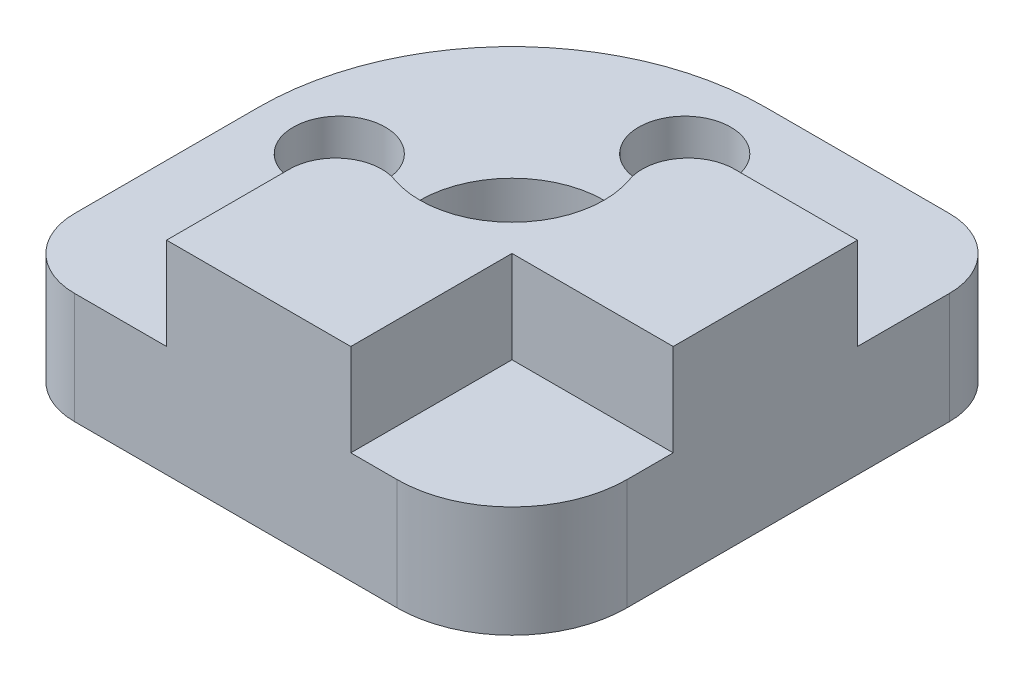
ISO-10303-21;
HEADER;
FILE_DESCRIPTION(('STEP AP214'),'2;1');
FILE_NAME('part.step','',(''),(''),'','','');
FILE_SCHEMA(('AUTOMOTIVE_DESIGN { 1 0 10303 214 1 1 1 1 }'));
ENDSEC;
DATA;
#1=APPLICATION_CONTEXT('core data for automotive mechanical design processes');
#2=APPLICATION_PROTOCOL_DEFINITION('international standard','automotive_design',2000,#1);
#3=PRODUCT_CONTEXT('',#1,'mechanical');
#4=PRODUCT('Part','Part','',(#3));
#5=PRODUCT_RELATED_PRODUCT_CATEGORY('part','',(#4));
#6=PRODUCT_DEFINITION_FORMATION('','',#4);
#7=PRODUCT_DEFINITION_CONTEXT('part definition',#1,'design');
#8=PRODUCT_DEFINITION('design','',#6,#7);
#9=PRODUCT_DEFINITION_SHAPE('','',#8);
#10=(LENGTH_UNIT() NAMED_UNIT(*) SI_UNIT(.MILLI.,.METRE.));
#11=(NAMED_UNIT(*) PLANE_ANGLE_UNIT() SI_UNIT($,.RADIAN.));
#12=(NAMED_UNIT(*) SI_UNIT($,.STERADIAN.) SOLID_ANGLE_UNIT());
#13=UNCERTAINTY_MEASURE_WITH_UNIT(LENGTH_MEASURE(1.E-05),#10,'distance_accuracy_value','');
#14=(GEOMETRIC_REPRESENTATION_CONTEXT(3) GLOBAL_UNCERTAINTY_ASSIGNED_CONTEXT((#13)) GLOBAL_UNIT_ASSIGNED_CONTEXT((#10,
#11,#12)) REPRESENTATION_CONTEXT('',''));
#15=CARTESIAN_POINT('',(0.,0.,0.));
#16=DIRECTION('',(0.,0.,1.));
#17=DIRECTION('',(1.,0.,0.));
#18=AXIS2_PLACEMENT_3D('',#15,#16,#17);
#19=CARTESIAN_POINT('',(0.,4.825,0.));
#20=DIRECTION('',(0.,1.,0.));
#21=DIRECTION('',(0.,0.,1.));
#22=AXIS2_PLACEMENT_3D('',#19,#20,#21);
#23=PLANE('',#22);
#24=DIRECTION('',(0.,0.,1.));
#25=VECTOR('',#24,1.);
#26=CARTESIAN_POINT('',(-4.,4.825,5.65685424949238));
#27=LINE('',#26,#25);
#28=CARTESIAN_POINT('',(-4.,4.825,5.65685424949238));
#29=VERTEX_POINT('',#28);
#30=CARTESIAN_POINT('',(-4.,4.825,11.));
#31=VERTEX_POINT('',#30);
#32=EDGE_CURVE('E49',#29,#31,#27,.T.);
#33=ORIENTED_EDGE('',*,*,#32,.F.);
#34=CARTESIAN_POINT('',(-2.,4.825,5.65685424949238));
#35=DIRECTION('',(0.,1.,0.));
#36=DIRECTION('',(0.,0.,1.));
#37=AXIS2_PLACEMENT_3D('',#34,#35,#36);
#38=CIRCLE('',#37,2.);
#39=CARTESIAN_POINT('',(-1.33333333333333,4.825,3.77123616632825));
#40=VERTEX_POINT('',#39);
#41=EDGE_CURVE('E192',#40,#29,#38,.T.);
#42=ORIENTED_EDGE('',*,*,#41,.F.);
#43=CARTESIAN_POINT('',(0.,4.825,0.));
#44=DIRECTION('',(0.,1.,0.));
#45=DIRECTION('',(0.,0.,1.));
#46=AXIS2_PLACEMENT_3D('',#43,#44,#45);
#47=CIRCLE('',#46,4.);
#48=CARTESIAN_POINT('',(3.77123616632825,4.825,-1.33333333333333));
#49=VERTEX_POINT('',#48);
#50=EDGE_CURVE('E220',#49,#40,#47,.T.);
#51=ORIENTED_EDGE('',*,*,#50,.F.);
#52=CARTESIAN_POINT('',(5.65685424949238,4.825,-2.));
#53=DIRECTION('',(0.,1.,0.));
#54=DIRECTION('',(0.,0.,-1.));
#55=AXIS2_PLACEMENT_3D('',#52,#53,#54);
#56=CIRCLE('',#55,2.);
#57=CARTESIAN_POINT('',(5.65685424949238,4.825,-4.));
#58=VERTEX_POINT('',#57);
#59=EDGE_CURVE('E56',#58,#49,#56,.T.);
#60=ORIENTED_EDGE('',*,*,#59,.F.);
#61=DIRECTION('',(-1.,0.,0.));
#62=VECTOR('',#61,1.);
#63=CARTESIAN_POINT('',(5.65685424949238,4.825,-4.));
#64=LINE('',#63,#62);
#65=CARTESIAN_POINT('',(11.,4.825,-4.));
#66=VERTEX_POINT('',#65);
#67=EDGE_CURVE('E309',#66,#58,#64,.T.);
#68=ORIENTED_EDGE('',*,*,#67,.F.);
#69=DIRECTION('',(0.,0.,-1.));
#70=VECTOR('',#69,1.);
#71=CARTESIAN_POINT('',(11.,4.825,6.));
#72=LINE('',#71,#70);
#73=CARTESIAN_POINT('',(11.,4.825,-7.99999999999998));
#74=VERTEX_POINT('',#73);
#75=EDGE_CURVE('E282',#66,#74,#72,.T.);
#76=ORIENTED_EDGE('',*,*,#75,.T.);
#77=CARTESIAN_POINT('',(8.,4.825,-8.));
#78=DIRECTION('',(0.,1.,0.));
#79=DIRECTION('',(0.,0.,1.));
#80=AXIS2_PLACEMENT_3D('',#77,#78,#79);
#81=CIRCLE('',#80,3.);
#82=CARTESIAN_POINT('',(7.99999999999998,4.825,-11.));
#83=VERTEX_POINT('',#82);
#84=EDGE_CURVE('E277',#74,#83,#81,.T.);
#85=ORIENTED_EDGE('',*,*,#84,.T.);
#86=DIRECTION('',(-1.,0.,0.));
#87=VECTOR('',#86,1.);
#88=CARTESIAN_POINT('',(0.,4.825,-11.));
#89=LINE('',#88,#87);
#90=CARTESIAN_POINT('',(0.,4.825,-11.));
#91=VERTEX_POINT('',#90);
#92=EDGE_CURVE('E259',#83,#91,#89,.T.);
#93=ORIENTED_EDGE('',*,*,#92,.T.);
#94=CARTESIAN_POINT('',(0.,4.825,0.));
#95=DIRECTION('',(0.,1.,0.));
#96=DIRECTION('',(0.,0.,1.));
#97=AXIS2_PLACEMENT_3D('',#94,#95,#96);
#98=CIRCLE('',#97,11.);
#99=CARTESIAN_POINT('',(-11.,4.825,0.));
#100=VERTEX_POINT('',#99);
#101=EDGE_CURVE('E221',#91,#100,#98,.T.);
#102=ORIENTED_EDGE('',*,*,#101,.T.);
#103=DIRECTION('',(0.,0.,1.));
#104=VECTOR('',#103,1.);
#105=CARTESIAN_POINT('',(-11.,4.825,0.));
#106=LINE('',#105,#104);
#107=CARTESIAN_POINT('',(-11.,4.825,7.99999999999998));
#108=VERTEX_POINT('',#107);
#109=EDGE_CURVE('E224',#100,#108,#106,.T.);
#110=ORIENTED_EDGE('',*,*,#109,.T.);
#111=CARTESIAN_POINT('',(-8.,4.825,8.));
#112=DIRECTION('',(0.,1.,0.));
#113=DIRECTION('',(0.,0.,-1.));
#114=AXIS2_PLACEMENT_3D('',#111,#112,#113);
#115=CIRCLE('',#114,3.);
#116=CARTESIAN_POINT('',(-7.99999999999998,4.825,11.));
#117=VERTEX_POINT('',#116);
#118=EDGE_CURVE('E227',#108,#117,#115,.T.);
#119=ORIENTED_EDGE('',*,*,#118,.T.);
#120=DIRECTION('',(1.,0.,0.));
#121=VECTOR('',#120,1.);
#122=CARTESIAN_POINT('',(6.,4.825,11.));
#123=LINE('',#122,#121);
#124=EDGE_CURVE('E237',#117,#31,#123,.T.);
#125=ORIENTED_EDGE('',*,*,#124,.T.);
#126=EDGE_LOOP('',(#33,#42,#51,#60,#68,#76,#85,#93,#102,#110,#119,#125));
#127=FACE_BOUND('',#126,.T.);
#128=CARTESIAN_POINT('',(0.,4.825,-7.5));
#129=DIRECTION('',(0.,1.,0.));
#130=DIRECTION('',(0.,0.,1.));
#131=AXIS2_PLACEMENT_3D('',#128,#129,#130);
#132=CIRCLE('',#131,2.);
#133=CARTESIAN_POINT('',(0.,4.825,-5.5));
#134=VERTEX_POINT('',#133);
#135=EDGE_CURVE('E180',#134,#134,#132,.T.);
#136=ORIENTED_EDGE('',*,*,#135,.F.);
#137=EDGE_LOOP('',(#136));
#138=FACE_BOUND('',#137,.T.);
#139=CARTESIAN_POINT('',(-7.5,4.825,0.));
#140=DIRECTION('',(0.,1.,0.));
#141=DIRECTION('',(0.,0.,1.));
#142=AXIS2_PLACEMENT_3D('',#139,#140,#141);
#143=CIRCLE('',#142,2.);
#144=CARTESIAN_POINT('',(-7.5,4.825,2.));
#145=VERTEX_POINT('',#144);
#146=EDGE_CURVE('E212',#145,#145,#143,.T.);
#147=ORIENTED_EDGE('',*,*,#146,.F.);
#148=EDGE_LOOP('',(#147));
#149=FACE_BOUND('',#148,.T.);
#150=ADVANCED_FACE('F32',(#127,#138,#149),#23,.T.);
#151=DIRECTION('',(1.,0.,0.));
#152=VECTOR('',#151,1.);
#153=CARTESIAN_POINT('',(4.,4.825,4.));
#154=LINE('',#153,#152);
#155=CARTESIAN_POINT('',(4.,4.825,4.));
#156=VERTEX_POINT('',#155);
#157=CARTESIAN_POINT('',(11.,4.825,4.));
#158=VERTEX_POINT('',#157);
#159=EDGE_CURVE('E307',#156,#158,#154,.T.);
#160=ORIENTED_EDGE('',*,*,#159,.F.);
#161=DIRECTION('',(0.,0.,-1.));
#162=VECTOR('',#161,1.);
#163=CARTESIAN_POINT('',(4.,4.825,11.));
#164=LINE('',#163,#162);
#165=CARTESIAN_POINT('',(4.,4.825,11.));
#166=VERTEX_POINT('',#165);
#167=EDGE_CURVE('E310',#166,#156,#164,.T.);
#168=ORIENTED_EDGE('',*,*,#167,.F.);
#169=CARTESIAN_POINT('',(6.,4.825,11.));
#170=VERTEX_POINT('',#169);
#171=EDGE_CURVE('E176',#166,#170,#123,.T.);
#172=ORIENTED_EDGE('',*,*,#171,.T.);
#173=CARTESIAN_POINT('',(6.,4.825,6.));
#174=DIRECTION('',(0.,1.,0.));
#175=DIRECTION('',(0.,0.,-1.));
#176=AXIS2_PLACEMENT_3D('',#173,#174,#175);
#177=CIRCLE('',#176,5.);
#178=CARTESIAN_POINT('',(11.,4.825,6.));
#179=VERTEX_POINT('',#178);
#180=EDGE_CURVE('E231',#170,#179,#177,.T.);
#181=ORIENTED_EDGE('',*,*,#180,.T.);
#182=EDGE_CURVE('E278',#179,#158,#72,.T.);
#183=ORIENTED_EDGE('',*,*,#182,.T.);
#184=EDGE_LOOP('',(#160,#168,#172,#181,#183));
#185=FACE_BOUND('',#184,.T.);
#186=ADVANCED_FACE('F291',(#185),#23,.T.);
#187=CARTESIAN_POINT('',(0.,0.,0.));
#188=DIRECTION('',(0.,1.,0.));
#189=DIRECTION('',(0.,0.,1.));
#190=AXIS2_PLACEMENT_3D('',#187,#188,#189);
#191=PLANE('',#190);
#192=CARTESIAN_POINT('',(-7.5,0.,0.));
#193=DIRECTION('',(0.,1.,0.));
#194=DIRECTION('',(0.,0.,1.));
#195=AXIS2_PLACEMENT_3D('',#192,#193,#194);
#196=CIRCLE('',#195,2.);
#197=CARTESIAN_POINT('',(-7.5,0.,2.));
#198=VERTEX_POINT('',#197);
#199=EDGE_CURVE('E210',#198,#198,#196,.T.);
#200=ORIENTED_EDGE('',*,*,#199,.T.);
#201=EDGE_LOOP('',(#200));
#202=FACE_BOUND('',#201,.T.);
#203=CARTESIAN_POINT('',(0.,0.,0.));
#204=DIRECTION('',(0.,1.,0.));
#205=DIRECTION('',(0.,0.,1.));
#206=AXIS2_PLACEMENT_3D('',#203,#204,#205);
#207=CIRCLE('',#206,11.);
#208=CARTESIAN_POINT('',(0.,0.,-11.));
#209=VERTEX_POINT('',#208);
#210=CARTESIAN_POINT('',(-11.,0.,0.));
#211=VERTEX_POINT('',#210);
#212=EDGE_CURVE('E273',#209,#211,#207,.T.);
#213=ORIENTED_EDGE('',*,*,#212,.F.);
#214=DIRECTION('',(-1.,0.,0.));
#215=VECTOR('',#214,1.);
#216=CARTESIAN_POINT('',(0.,0.,-11.));
#217=LINE('',#216,#215);
#218=CARTESIAN_POINT('',(7.99999999999998,0.,-11.));
#219=VERTEX_POINT('',#218);
#220=EDGE_CURVE('E225',#219,#209,#217,.T.);
#221=ORIENTED_EDGE('',*,*,#220,.F.);
#222=CARTESIAN_POINT('',(8.,0.,-8.));
#223=DIRECTION('',(0.,1.,0.));
#224=DIRECTION('',(0.,0.,1.));
#225=AXIS2_PLACEMENT_3D('',#222,#223,#224);
#226=CIRCLE('',#225,3.);
#227=CARTESIAN_POINT('',(11.,0.,-7.99999999999998));
#228=VERTEX_POINT('',#227);
#229=EDGE_CURVE('E261',#228,#219,#226,.T.);
#230=ORIENTED_EDGE('',*,*,#229,.F.);
#231=DIRECTION('',(0.,0.,-1.));
#232=VECTOR('',#231,1.);
#233=CARTESIAN_POINT('',(11.,0.,6.));
#234=LINE('',#233,#232);
#235=CARTESIAN_POINT('',(11.,0.,6.));
#236=VERTEX_POINT('',#235);
#237=EDGE_CURVE('E263',#236,#228,#234,.T.);
#238=ORIENTED_EDGE('',*,*,#237,.F.);
#239=CARTESIAN_POINT('',(6.,0.,6.));
#240=DIRECTION('',(0.,1.,0.));
#241=DIRECTION('',(0.,0.,-1.));
#242=AXIS2_PLACEMENT_3D('',#239,#240,#241);
#243=CIRCLE('',#242,5.);
#244=CARTESIAN_POINT('',(6.,0.,11.));
#245=VERTEX_POINT('',#244);
#246=EDGE_CURVE('E265',#245,#236,#243,.T.);
#247=ORIENTED_EDGE('',*,*,#246,.F.);
#248=DIRECTION('',(1.,0.,0.));
#249=VECTOR('',#248,1.);
#250=CARTESIAN_POINT('',(6.,0.,11.));
#251=LINE('',#250,#249);
#252=CARTESIAN_POINT('',(-7.99999999999998,0.,11.));
#253=VERTEX_POINT('',#252);
#254=EDGE_CURVE('E267',#253,#245,#251,.T.);
#255=ORIENTED_EDGE('',*,*,#254,.F.);
#256=CARTESIAN_POINT('',(-8.,0.,8.));
#257=DIRECTION('',(0.,1.,0.));
#258=DIRECTION('',(0.,0.,-1.));
#259=AXIS2_PLACEMENT_3D('',#256,#257,#258);
#260=CIRCLE('',#259,3.);
#261=CARTESIAN_POINT('',(-11.,0.,7.99999999999998));
#262=VERTEX_POINT('',#261);
#263=EDGE_CURVE('E269',#262,#253,#260,.T.);
#264=ORIENTED_EDGE('',*,*,#263,.F.);
#265=DIRECTION('',(0.,0.,1.));
#266=VECTOR('',#265,1.);
#267=CARTESIAN_POINT('',(-11.,0.,0.));
#268=LINE('',#267,#266);
#269=EDGE_CURVE('E271',#211,#262,#268,.T.);
#270=ORIENTED_EDGE('',*,*,#269,.F.);
#271=EDGE_LOOP('',(#213,#221,#230,#238,#247,#255,#264,#270));
#272=FACE_BOUND('',#271,.T.);
#273=CARTESIAN_POINT('',(0.,0.,0.));
#274=DIRECTION('',(0.,1.,0.));
#275=DIRECTION('',(0.,0.,1.));
#276=AXIS2_PLACEMENT_3D('',#273,#274,#275);
#277=CIRCLE('',#276,4.);
#278=CARTESIAN_POINT('',(0.,0.,4.));
#279=VERTEX_POINT('',#278);
#280=EDGE_CURVE('E215',#279,#279,#277,.T.);
#281=ORIENTED_EDGE('',*,*,#280,.T.);
#282=EDGE_LOOP('',(#281));
#283=FACE_BOUND('',#282,.T.);
#284=CARTESIAN_POINT('',(0.,0.,-7.5));
#285=DIRECTION('',(0.,1.,0.));
#286=DIRECTION('',(0.,0.,1.));
#287=AXIS2_PLACEMENT_3D('',#284,#285,#286);
#288=CIRCLE('',#287,2.);
#289=CARTESIAN_POINT('',(0.,0.,-5.5));
#290=VERTEX_POINT('',#289);
#291=EDGE_CURVE('E177',#290,#290,#288,.T.);
#292=ORIENTED_EDGE('',*,*,#291,.T.);
#293=EDGE_LOOP('',(#292));
#294=FACE_BOUND('',#293,.T.);
#295=ADVANCED_FACE('F373',(#202,#272,#283,#294),#191,.F.);
#296=CARTESIAN_POINT('',(0.,4.825,0.));
#297=DIRECTION('',(0.,-1.,0.));
#298=DIRECTION('',(0.,0.,-1.));
#299=AXIS2_PLACEMENT_3D('',#296,#297,#298);
#300=CYLINDRICAL_SURFACE('',#299,11.);
#301=ORIENTED_EDGE('',*,*,#212,.T.);
#302=DIRECTION('',(0.,-1.,0.));
#303=VECTOR('',#302,1.);
#304=CARTESIAN_POINT('',(-11.,4.825,0.));
#305=LINE('',#304,#303);
#306=EDGE_CURVE('E11',#100,#211,#305,.T.);
#307=ORIENTED_EDGE('',*,*,#306,.F.);
#308=ORIENTED_EDGE('',*,*,#101,.F.);
#309=DIRECTION('',(0.,-1.,0.));
#310=VECTOR('',#309,1.);
#311=CARTESIAN_POINT('',(0.,4.825,-11.));
#312=LINE('',#311,#310);
#313=EDGE_CURVE('E256',#91,#209,#312,.T.);
#314=ORIENTED_EDGE('',*,*,#313,.T.);
#315=EDGE_LOOP('',(#301,#307,#308,#314));
#316=FACE_BOUND('',#315,.T.);
#317=ADVANCED_FACE('F34',(#316),#300,.T.);
#318=CARTESIAN_POINT('',(-11.,4.825,0.));
#319=DIRECTION('',(1.,0.,0.));
#320=DIRECTION('',(0.,0.,-1.));
#321=AXIS2_PLACEMENT_3D('',#318,#319,#320);
#322=PLANE('',#321);
#323=ORIENTED_EDGE('',*,*,#269,.T.);
#324=DIRECTION('',(0.,-1.,0.));
#325=VECTOR('',#324,1.);
#326=CARTESIAN_POINT('',(-11.,4.825,7.99999999999998));
#327=LINE('',#326,#325);
#328=EDGE_CURVE('E41',#108,#262,#327,.T.);
#329=ORIENTED_EDGE('',*,*,#328,.F.);
#330=ORIENTED_EDGE('',*,*,#109,.F.);
#331=ORIENTED_EDGE('',*,*,#306,.T.);
#332=EDGE_LOOP('',(#323,#329,#330,#331));
#333=FACE_BOUND('',#332,.T.);
#334=ADVANCED_FACE('F389',(#333),#322,.F.);
#335=CARTESIAN_POINT('',(-8.,4.825,8.));
#336=DIRECTION('',(0.,-1.,0.));
#337=DIRECTION('',(0.,0.,-1.));
#338=AXIS2_PLACEMENT_3D('',#335,#336,#337);
#339=CYLINDRICAL_SURFACE('',#338,3.);
#340=ORIENTED_EDGE('',*,*,#263,.T.);
#341=DIRECTION('',(0.,-1.,0.));
#342=VECTOR('',#341,1.);
#343=CARTESIAN_POINT('',(-7.99999999999998,4.825,11.));
#344=LINE('',#343,#342);
#345=EDGE_CURVE('E241',#117,#253,#344,.T.);
#346=ORIENTED_EDGE('',*,*,#345,.F.);
#347=ORIENTED_EDGE('',*,*,#118,.F.);
#348=ORIENTED_EDGE('',*,*,#328,.T.);
#349=EDGE_LOOP('',(#340,#346,#347,#348));
#350=FACE_BOUND('',#349,.T.);
#351=ADVANCED_FACE('F369',(#350),#339,.T.);
#352=CARTESIAN_POINT('',(6.,4.825,11.));
#353=DIRECTION('',(0.,0.,-1.));
#354=DIRECTION('',(-1.,0.,0.));
#355=AXIS2_PLACEMENT_3D('',#352,#353,#354);
#356=PLANE('',#355);
#357=ORIENTED_EDGE('',*,*,#254,.T.);
#358=DIRECTION('',(0.,-1.,0.));
#359=VECTOR('',#358,1.);
#360=CARTESIAN_POINT('',(6.,4.825,11.));
#361=LINE('',#360,#359);
#362=EDGE_CURVE('E244',#170,#245,#361,.T.);
#363=ORIENTED_EDGE('',*,*,#362,.F.);
#364=ORIENTED_EDGE('',*,*,#171,.F.);
#365=DIRECTION('',(0.,-1.,0.));
#366=VECTOR('',#365,1.);
#367=CARTESIAN_POINT('',(4.,8.825,11.));
#368=LINE('',#367,#366);
#369=CARTESIAN_POINT('',(4.,8.825,11.));
#370=VERTEX_POINT('',#369);
#371=EDGE_CURVE('E157',#370,#166,#368,.T.);
#372=ORIENTED_EDGE('',*,*,#371,.F.);
#373=DIRECTION('',(1.,0.,0.));
#374=VECTOR('',#373,1.);
#375=CARTESIAN_POINT('',(-4.,8.825,11.));
#376=LINE('',#375,#374);
#377=CARTESIAN_POINT('',(-4.,8.825,11.));
#378=VERTEX_POINT('',#377);
#379=EDGE_CURVE('E163',#378,#370,#376,.T.);
#380=ORIENTED_EDGE('',*,*,#379,.F.);
#381=DIRECTION('',(0.,-1.,0.));
#382=VECTOR('',#381,1.);
#383=CARTESIAN_POINT('',(-4.,8.825,11.));
#384=LINE('',#383,#382);
#385=EDGE_CURVE('E193',#378,#31,#384,.T.);
#386=ORIENTED_EDGE('',*,*,#385,.T.);
#387=ORIENTED_EDGE('',*,*,#124,.F.);
#388=ORIENTED_EDGE('',*,*,#345,.T.);
#389=EDGE_LOOP('',(#357,#363,#364,#372,#380,#386,#387,#388));
#390=FACE_BOUND('',#389,.T.);
#391=ADVANCED_FACE('F174',(#390),#356,.F.);
#392=CARTESIAN_POINT('',(6.,4.825,6.));
#393=DIRECTION('',(0.,-1.,0.));
#394=DIRECTION('',(0.,0.,-1.));
#395=AXIS2_PLACEMENT_3D('',#392,#393,#394);
#396=CYLINDRICAL_SURFACE('',#395,5.);
#397=ORIENTED_EDGE('',*,*,#246,.T.);
#398=DIRECTION('',(0.,-1.,0.));
#399=VECTOR('',#398,1.);
#400=CARTESIAN_POINT('',(11.,4.825,6.));
#401=LINE('',#400,#399);
#402=EDGE_CURVE('E247',#179,#236,#401,.T.);
#403=ORIENTED_EDGE('',*,*,#402,.F.);
#404=ORIENTED_EDGE('',*,*,#180,.F.);
#405=ORIENTED_EDGE('',*,*,#362,.T.);
#406=EDGE_LOOP('',(#397,#403,#404,#405));
#407=FACE_BOUND('',#406,.T.);
#408=ADVANCED_FACE('F293',(#407),#396,.T.);
#409=CARTESIAN_POINT('',(11.,4.825,6.));
#410=DIRECTION('',(-1.,0.,0.));
#411=DIRECTION('',(0.,0.,1.));
#412=AXIS2_PLACEMENT_3D('',#409,#410,#411);
#413=PLANE('',#412);
#414=ORIENTED_EDGE('',*,*,#237,.T.);
#415=DIRECTION('',(0.,-1.,0.));
#416=VECTOR('',#415,1.);
#417=CARTESIAN_POINT('',(11.,4.825,-7.99999999999998));
#418=LINE('',#417,#416);
#419=EDGE_CURVE('E250',#74,#228,#418,.T.);
#420=ORIENTED_EDGE('',*,*,#419,.F.);
#421=ORIENTED_EDGE('',*,*,#75,.F.);
#422=DIRECTION('',(0.,-1.,0.));
#423=VECTOR('',#422,1.);
#424=CARTESIAN_POINT('',(11.,8.825,-4.));
#425=LINE('',#424,#423);
#426=CARTESIAN_POINT('',(11.,8.825,-4.));
#427=VERTEX_POINT('',#426);
#428=EDGE_CURVE('E206',#427,#66,#425,.T.);
#429=ORIENTED_EDGE('',*,*,#428,.F.);
#430=DIRECTION('',(0.,0.,-1.));
#431=VECTOR('',#430,1.);
#432=CARTESIAN_POINT('',(11.,8.825,4.));
#433=LINE('',#432,#431);
#434=CARTESIAN_POINT('',(11.,8.825,4.));
#435=VERTEX_POINT('',#434);
#436=EDGE_CURVE('E302',#435,#427,#433,.T.);
#437=ORIENTED_EDGE('',*,*,#436,.F.);
#438=DIRECTION('',(0.,-1.,0.));
#439=VECTOR('',#438,1.);
#440=CARTESIAN_POINT('',(11.,8.825,4.));
#441=LINE('',#440,#439);
#442=EDGE_CURVE('E182',#435,#158,#441,.T.);
#443=ORIENTED_EDGE('',*,*,#442,.T.);
#444=ORIENTED_EDGE('',*,*,#182,.F.);
#445=ORIENTED_EDGE('',*,*,#402,.T.);
#446=EDGE_LOOP('',(#414,#420,#421,#429,#437,#443,#444,#445));
#447=FACE_BOUND('',#446,.T.);
#448=ADVANCED_FACE('F298',(#447),#413,.F.);
#449=CARTESIAN_POINT('',(8.,4.825,-8.));
#450=DIRECTION('',(0.,-1.,0.));
#451=DIRECTION('',(0.,0.,-1.));
#452=AXIS2_PLACEMENT_3D('',#449,#450,#451);
#453=CYLINDRICAL_SURFACE('',#452,3.);
#454=ORIENTED_EDGE('',*,*,#229,.T.);
#455=DIRECTION('',(0.,-1.,0.));
#456=VECTOR('',#455,1.);
#457=CARTESIAN_POINT('',(7.99999999999998,4.825,-11.));
#458=LINE('',#457,#456);
#459=EDGE_CURVE('E253',#83,#219,#458,.T.);
#460=ORIENTED_EDGE('',*,*,#459,.F.);
#461=ORIENTED_EDGE('',*,*,#84,.F.);
#462=ORIENTED_EDGE('',*,*,#419,.T.);
#463=EDGE_LOOP('',(#454,#460,#461,#462));
#464=FACE_BOUND('',#463,.T.);
#465=ADVANCED_FACE('F379',(#464),#453,.T.);
#466=CARTESIAN_POINT('',(0.,4.825,-11.));
#467=DIRECTION('',(0.,0.,1.));
#468=DIRECTION('',(1.,0.,0.));
#469=AXIS2_PLACEMENT_3D('',#466,#467,#468);
#470=PLANE('',#469);
#471=ORIENTED_EDGE('',*,*,#220,.T.);
#472=ORIENTED_EDGE('',*,*,#313,.F.);
#473=ORIENTED_EDGE('',*,*,#92,.F.);
#474=ORIENTED_EDGE('',*,*,#459,.T.);
#475=EDGE_LOOP('',(#471,#472,#473,#474));
#476=FACE_BOUND('',#475,.T.);
#477=ADVANCED_FACE('F386',(#476),#470,.F.);
#478=CARTESIAN_POINT('',(0.,4.825,0.));
#479=DIRECTION('',(0.,-1.,0.));
#480=DIRECTION('',(0.,0.,-1.));
#481=AXIS2_PLACEMENT_3D('',#478,#479,#480);
#482=CYLINDRICAL_SURFACE('',#481,4.);
#483=ORIENTED_EDGE('',*,*,#50,.T.);
#484=DIRECTION('',(0.,-1.,0.));
#485=VECTOR('',#484,1.);
#486=CARTESIAN_POINT('',(-1.33333333333333,8.825,3.77123616632825));
#487=LINE('',#486,#485);
#488=CARTESIAN_POINT('',(-1.33333333333333,8.825,3.77123616632825));
#489=VERTEX_POINT('',#488);
#490=EDGE_CURVE('E203',#489,#40,#487,.T.);
#491=ORIENTED_EDGE('',*,*,#490,.F.);
#492=CARTESIAN_POINT('',(0.,8.825,0.));
#493=DIRECTION('',(0.,-1.,0.));
#494=DIRECTION('',(0.,0.,1.));
#495=AXIS2_PLACEMENT_3D('',#492,#493,#494);
#496=CIRCLE('',#495,4.);
#497=CARTESIAN_POINT('',(3.77123616632825,8.825,-1.33333333333334));
#498=VERTEX_POINT('',#497);
#499=EDGE_CURVE('E317',#498,#489,#496,.T.);
#500=ORIENTED_EDGE('',*,*,#499,.F.);
#501=DIRECTION('',(0.,-1.,0.));
#502=VECTOR('',#501,1.);
#503=CARTESIAN_POINT('',(3.77123616632825,8.825,-1.33333333333334));
#504=LINE('',#503,#502);
#505=EDGE_CURVE('E207',#498,#49,#504,.T.);
#506=ORIENTED_EDGE('',*,*,#505,.T.);
#507=EDGE_LOOP('',(#483,#491,#500,#506));
#508=FACE_BOUND('',#507,.T.);
#509=ORIENTED_EDGE('',*,*,#280,.F.);
#510=EDGE_LOOP('',(#509));
#511=FACE_BOUND('',#510,.T.);
#512=ADVANCED_FACE('F332',(#508,#511),#482,.F.);
#513=CARTESIAN_POINT('',(-7.5,4.825,0.));
#514=DIRECTION('',(0.,-1.,0.));
#515=DIRECTION('',(0.,0.,-1.));
#516=AXIS2_PLACEMENT_3D('',#513,#514,#515);
#517=CYLINDRICAL_SURFACE('',#516,2.);
#518=ORIENTED_EDGE('',*,*,#146,.T.);
#519=EDGE_LOOP('',(#518));
#520=FACE_BOUND('',#519,.T.);
#521=ORIENTED_EDGE('',*,*,#199,.F.);
#522=EDGE_LOOP('',(#521));
#523=FACE_BOUND('',#522,.T.);
#524=ADVANCED_FACE('F444',(#520,#523),#517,.F.);
#525=CARTESIAN_POINT('',(0.,4.825,-7.5));
#526=DIRECTION('',(0.,-1.,0.));
#527=DIRECTION('',(0.,0.,-1.));
#528=AXIS2_PLACEMENT_3D('',#525,#526,#527);
#529=CYLINDRICAL_SURFACE('',#528,2.);
#530=ORIENTED_EDGE('',*,*,#135,.T.);
#531=EDGE_LOOP('',(#530));
#532=FACE_BOUND('',#531,.T.);
#533=ORIENTED_EDGE('',*,*,#291,.F.);
#534=EDGE_LOOP('',(#533));
#535=FACE_BOUND('',#534,.T.);
#536=ADVANCED_FACE('F450',(#532,#535),#529,.F.);
#537=CARTESIAN_POINT('',(4.,8.825,11.));
#538=DIRECTION('',(-1.,0.,0.));
#539=DIRECTION('',(0.,0.,1.));
#540=AXIS2_PLACEMENT_3D('',#537,#538,#539);
#541=PLANE('',#540);
#542=ORIENTED_EDGE('',*,*,#167,.T.);
#543=DIRECTION('',(0.,-1.,0.));
#544=VECTOR('',#543,1.);
#545=CARTESIAN_POINT('',(4.,8.825,4.));
#546=LINE('',#545,#544);
#547=CARTESIAN_POINT('',(4.,8.825,4.));
#548=VERTEX_POINT('',#547);
#549=EDGE_CURVE('E159',#548,#156,#546,.T.);
#550=ORIENTED_EDGE('',*,*,#549,.F.);
#551=DIRECTION('',(0.,0.,-1.));
#552=VECTOR('',#551,1.);
#553=CARTESIAN_POINT('',(4.,8.825,11.));
#554=LINE('',#553,#552);
#555=EDGE_CURVE('E152',#370,#548,#554,.T.);
#556=ORIENTED_EDGE('',*,*,#555,.F.);
#557=ORIENTED_EDGE('',*,*,#371,.T.);
#558=EDGE_LOOP('',(#542,#550,#556,#557));
#559=FACE_BOUND('',#558,.T.);
#560=ADVANCED_FACE('F155',(#559),#541,.F.);
#561=CARTESIAN_POINT('',(4.,8.825,4.));
#562=DIRECTION('',(0.,0.,-1.));
#563=DIRECTION('',(-1.,0.,0.));
#564=AXIS2_PLACEMENT_3D('',#561,#562,#563);
#565=PLANE('',#564);
#566=ORIENTED_EDGE('',*,*,#159,.T.);
#567=ORIENTED_EDGE('',*,*,#442,.F.);
#568=DIRECTION('',(1.,0.,0.));
#569=VECTOR('',#568,1.);
#570=CARTESIAN_POINT('',(4.,8.825,4.));
#571=LINE('',#570,#569);
#572=EDGE_CURVE('E162',#548,#435,#571,.T.);
#573=ORIENTED_EDGE('',*,*,#572,.F.);
#574=ORIENTED_EDGE('',*,*,#549,.T.);
#575=EDGE_LOOP('',(#566,#567,#573,#574));
#576=FACE_BOUND('',#575,.T.);
#577=ADVANCED_FACE('F324',(#576),#565,.F.);
#578=CARTESIAN_POINT('',(5.65685424949238,8.825,-4.));
#579=DIRECTION('',(0.,0.,1.));
#580=DIRECTION('',(1.,0.,0.));
#581=AXIS2_PLACEMENT_3D('',#578,#579,#580);
#582=PLANE('',#581);
#583=ORIENTED_EDGE('',*,*,#67,.T.);
#584=DIRECTION('',(0.,-1.,0.));
#585=VECTOR('',#584,1.);
#586=CARTESIAN_POINT('',(5.65685424949238,8.825,-4.));
#587=LINE('',#586,#585);
#588=CARTESIAN_POINT('',(5.65685424949238,8.825,-4.));
#589=VERTEX_POINT('',#588);
#590=EDGE_CURVE('E204',#589,#58,#587,.T.);
#591=ORIENTED_EDGE('',*,*,#590,.F.);
#592=DIRECTION('',(-1.,0.,0.));
#593=VECTOR('',#592,1.);
#594=CARTESIAN_POINT('',(5.65685424949238,8.825,-4.));
#595=LINE('',#594,#593);
#596=EDGE_CURVE('E321',#427,#589,#595,.T.);
#597=ORIENTED_EDGE('',*,*,#596,.F.);
#598=ORIENTED_EDGE('',*,*,#428,.T.);
#599=EDGE_LOOP('',(#583,#591,#597,#598));
#600=FACE_BOUND('',#599,.T.);
#601=ADVANCED_FACE('F355',(#600),#582,.F.);
#602=CARTESIAN_POINT('',(5.65685424949238,8.825,-2.));
#603=DIRECTION('',(0.,-1.,0.));
#604=DIRECTION('',(0.,0.,-1.));
#605=AXIS2_PLACEMENT_3D('',#602,#603,#604);
#606=CYLINDRICAL_SURFACE('',#605,2.);
#607=ORIENTED_EDGE('',*,*,#59,.T.);
#608=ORIENTED_EDGE('',*,*,#505,.F.);
#609=CARTESIAN_POINT('',(5.65685424949238,8.825,-2.));
#610=DIRECTION('',(0.,1.,0.));
#611=DIRECTION('',(0.,0.,-1.));
#612=AXIS2_PLACEMENT_3D('',#609,#610,#611);
#613=CIRCLE('',#612,2.);
#614=EDGE_CURVE('E319',#589,#498,#613,.T.);
#615=ORIENTED_EDGE('',*,*,#614,.F.);
#616=ORIENTED_EDGE('',*,*,#590,.T.);
#617=EDGE_LOOP('',(#607,#608,#615,#616));
#618=FACE_BOUND('',#617,.T.);
#619=ADVANCED_FACE('F359',(#618),#606,.T.);
#620=CARTESIAN_POINT('',(-2.,8.825,5.65685424949238));
#621=DIRECTION('',(0.,-1.,0.));
#622=DIRECTION('',(0.,0.,-1.));
#623=AXIS2_PLACEMENT_3D('',#620,#621,#622);
#624=CYLINDRICAL_SURFACE('',#623,2.);
#625=ORIENTED_EDGE('',*,*,#41,.T.);
#626=DIRECTION('',(0.,-1.,0.));
#627=VECTOR('',#626,1.);
#628=CARTESIAN_POINT('',(-4.,8.825,5.65685424949238));
#629=LINE('',#628,#627);
#630=CARTESIAN_POINT('',(-4.,8.825,5.65685424949238));
#631=VERTEX_POINT('',#630);
#632=EDGE_CURVE('E200',#631,#29,#629,.T.);
#633=ORIENTED_EDGE('',*,*,#632,.F.);
#634=CARTESIAN_POINT('',(-2.,8.825,5.65685424949238));
#635=DIRECTION('',(0.,1.,0.));
#636=DIRECTION('',(0.,0.,1.));
#637=AXIS2_PLACEMENT_3D('',#634,#635,#636);
#638=CIRCLE('',#637,2.);
#639=EDGE_CURVE('E315',#489,#631,#638,.T.);
#640=ORIENTED_EDGE('',*,*,#639,.F.);
#641=ORIENTED_EDGE('',*,*,#490,.T.);
#642=EDGE_LOOP('',(#625,#633,#640,#641));
#643=FACE_BOUND('',#642,.T.);
#644=ADVANCED_FACE('F338',(#643),#624,.T.);
#645=CARTESIAN_POINT('',(-4.,8.825,5.65685424949238));
#646=DIRECTION('',(1.,0.,0.));
#647=DIRECTION('',(0.,0.,-1.));
#648=AXIS2_PLACEMENT_3D('',#645,#646,#647);
#649=PLANE('',#648);
#650=ORIENTED_EDGE('',*,*,#32,.T.);
#651=ORIENTED_EDGE('',*,*,#385,.F.);
#652=DIRECTION('',(0.,0.,1.));
#653=VECTOR('',#652,1.);
#654=CARTESIAN_POINT('',(-4.,8.825,5.65685424949238));
#655=LINE('',#654,#653);
#656=EDGE_CURVE('E168',#631,#378,#655,.T.);
#657=ORIENTED_EDGE('',*,*,#656,.F.);
#658=ORIENTED_EDGE('',*,*,#632,.T.);
#659=EDGE_LOOP('',(#650,#651,#657,#658));
#660=FACE_BOUND('',#659,.T.);
#661=ADVANCED_FACE('F361',(#660),#649,.F.);
#662=CARTESIAN_POINT('',(5.65685424949238,8.825,-2.));
#663=DIRECTION('',(0.,-1.,0.));
#664=DIRECTION('',(0.,0.,-1.));
#665=AXIS2_PLACEMENT_3D('',#662,#663,#664);
#666=PLANE('',#665);
#667=ORIENTED_EDGE('',*,*,#379,.T.);
#668=ORIENTED_EDGE('',*,*,#555,.T.);
#669=ORIENTED_EDGE('',*,*,#572,.T.);
#670=ORIENTED_EDGE('',*,*,#436,.T.);
#671=ORIENTED_EDGE('',*,*,#596,.T.);
#672=ORIENTED_EDGE('',*,*,#614,.T.);
#673=ORIENTED_EDGE('',*,*,#499,.T.);
#674=ORIENTED_EDGE('',*,*,#639,.T.);
#675=ORIENTED_EDGE('',*,*,#656,.T.);
#676=EDGE_LOOP('',(#667,#668,#669,#670,#671,#672,#673,#674,#675));
#677=FACE_BOUND('',#676,.T.);
#678=ADVANCED_FACE('F166',(#677),#666,.F.);
#679=CLOSED_SHELL('',(#150,#186,#295,#317,#334,#351,#391,#408,#448,#465,#477,#512,#524,#536,
#560,#577,#601,#619,#644,#661,#678));
#680=MANIFOLD_SOLID_BREP('B2',#679);
#681=ADVANCED_BREP_SHAPE_REPRESENTATION('',(#18,#680),#14);
#682=SHAPE_DEFINITION_REPRESENTATION(#9,#681);
ENDSEC;
END-ISO-10303-21;
